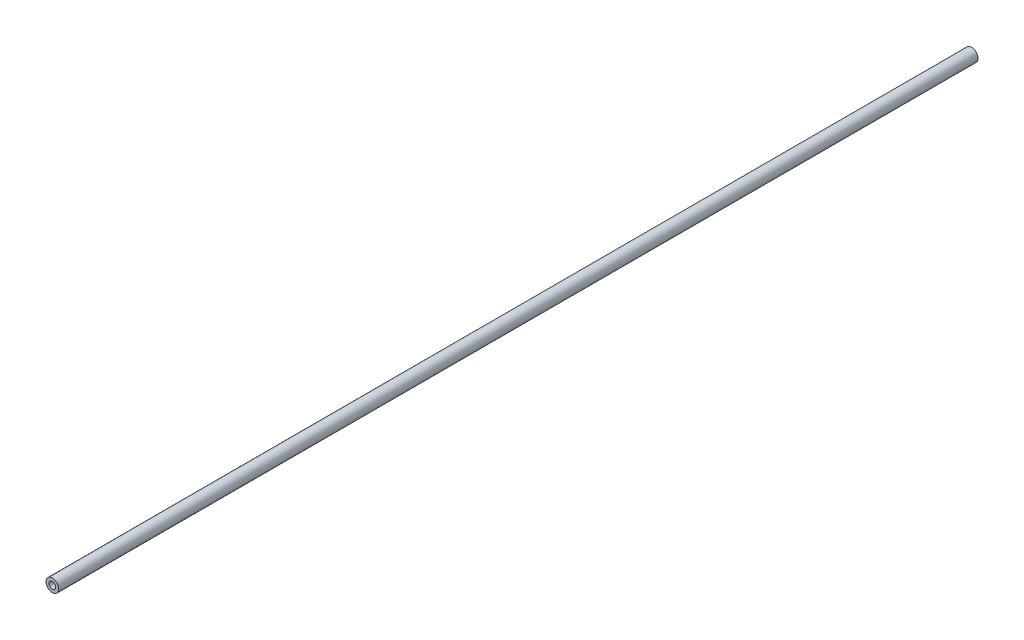
ISO-10303-21;
HEADER;
FILE_DESCRIPTION(('STEP AP214'),'2;1');
FILE_NAME('part.step','',(''),(''),'','','');
FILE_SCHEMA(('AUTOMOTIVE_DESIGN { 1 0 10303 214 1 1 1 1 }'));
ENDSEC;
DATA;
#1=APPLICATION_CONTEXT('core data for automotive mechanical design processes');
#2=APPLICATION_PROTOCOL_DEFINITION('international standard','automotive_design',2000,#1);
#3=PRODUCT_CONTEXT('',#1,'mechanical');
#4=PRODUCT('Part','Part','',(#3));
#5=PRODUCT_RELATED_PRODUCT_CATEGORY('part','',(#4));
#6=PRODUCT_DEFINITION_FORMATION('','',#4);
#7=PRODUCT_DEFINITION_CONTEXT('part definition',#1,'design');
#8=PRODUCT_DEFINITION('design','',#6,#7);
#9=PRODUCT_DEFINITION_SHAPE('','',#8);
#10=(LENGTH_UNIT() NAMED_UNIT(*) SI_UNIT(.MILLI.,.METRE.));
#11=(NAMED_UNIT(*) PLANE_ANGLE_UNIT() SI_UNIT($,.RADIAN.));
#12=(NAMED_UNIT(*) SI_UNIT($,.STERADIAN.) SOLID_ANGLE_UNIT());
#13=UNCERTAINTY_MEASURE_WITH_UNIT(LENGTH_MEASURE(1.E-05),#10,'distance_accuracy_value','');
#14=(GEOMETRIC_REPRESENTATION_CONTEXT(3) GLOBAL_UNCERTAINTY_ASSIGNED_CONTEXT((#13)) GLOBAL_UNIT_ASSIGNED_CONTEXT((#10,
#11,#12)) REPRESENTATION_CONTEXT('',''));
#15=CARTESIAN_POINT('',(0.,0.,0.));
#16=DIRECTION('',(0.,0.,1.));
#17=DIRECTION('',(1.,0.,0.));
#18=AXIS2_PLACEMENT_3D('',#15,#16,#17);
#19=CARTESIAN_POINT('',(0.,0.,-685.8));
#20=DIRECTION('',(0.,0.,1.));
#21=DIRECTION('',(1.,0.,0.));
#22=AXIS2_PLACEMENT_3D('',#19,#20,#21);
#23=CYLINDRICAL_SURFACE('',#22,4.7625);
#24=CARTESIAN_POINT('',(0.,0.,-685.8));
#25=DIRECTION('',(0.,0.,1.));
#26=DIRECTION('',(1.,0.,0.));
#27=AXIS2_PLACEMENT_3D('',#24,#25,#26);
#28=CIRCLE('',#27,4.7625);
#29=CARTESIAN_POINT('',(4.7625,0.,-685.8));
#30=VERTEX_POINT('',#29);
#31=EDGE_CURVE('E10',#30,#30,#28,.T.);
#32=ORIENTED_EDGE('',*,*,#31,.T.);
#33=EDGE_LOOP('',(#32));
#34=FACE_BOUND('',#33,.T.);
#35=CARTESIAN_POINT('',(0.,0.,0.));
#36=DIRECTION('',(0.,0.,1.));
#37=DIRECTION('',(1.,0.,0.));
#38=AXIS2_PLACEMENT_3D('',#35,#36,#37);
#39=CIRCLE('',#38,4.7625);
#40=CARTESIAN_POINT('',(4.7625,0.,0.));
#41=VERTEX_POINT('',#40);
#42=EDGE_CURVE('E40',#41,#41,#39,.T.);
#43=ORIENTED_EDGE('',*,*,#42,.F.);
#44=EDGE_LOOP('',(#43));
#45=FACE_BOUND('',#44,.T.);
#46=ADVANCED_FACE('F37',(#34,#45),#23,.T.);
#47=CARTESIAN_POINT('',(0.,0.,-685.8));
#48=DIRECTION('',(0.,0.,1.));
#49=DIRECTION('',(1.,0.,0.));
#50=AXIS2_PLACEMENT_3D('',#47,#48,#49);
#51=PLANE('',#50);
#52=CARTESIAN_POINT('',(0.,0.,-685.8));
#53=DIRECTION('',(0.,0.,1.));
#54=DIRECTION('',(1.,0.,0.));
#55=AXIS2_PLACEMENT_3D('',#52,#53,#54);
#56=CIRCLE('',#55,2.4892);
#57=CARTESIAN_POINT('',(2.4892,0.,-685.8));
#58=VERTEX_POINT('',#57);
#59=EDGE_CURVE('E47',#58,#58,#56,.T.);
#60=ORIENTED_EDGE('',*,*,#59,.T.);
#61=EDGE_LOOP('',(#60));
#62=FACE_BOUND('',#61,.T.);
#63=ORIENTED_EDGE('',*,*,#31,.F.);
#64=EDGE_LOOP('',(#63));
#65=FACE_BOUND('',#64,.T.);
#66=ADVANCED_FACE('F55',(#62,#65),#51,.F.);
#67=CARTESIAN_POINT('',(0.,0.,0.));
#68=DIRECTION('',(0.,0.,1.));
#69=DIRECTION('',(1.,0.,0.));
#70=AXIS2_PLACEMENT_3D('',#67,#68,#69);
#71=PLANE('',#70);
#72=CARTESIAN_POINT('',(0.,0.,0.));
#73=DIRECTION('',(0.,0.,1.));
#74=DIRECTION('',(1.,0.,0.));
#75=AXIS2_PLACEMENT_3D('',#72,#73,#74);
#76=CIRCLE('',#75,2.4892);
#77=CARTESIAN_POINT('',(2.4892,0.,0.));
#78=VERTEX_POINT('',#77);
#79=EDGE_CURVE('E49',#78,#78,#76,.T.);
#80=ORIENTED_EDGE('',*,*,#79,.F.);
#81=EDGE_LOOP('',(#80));
#82=FACE_BOUND('',#81,.T.);
#83=ORIENTED_EDGE('',*,*,#42,.T.);
#84=EDGE_LOOP('',(#83));
#85=FACE_BOUND('',#84,.T.);
#86=ADVANCED_FACE('F61',(#82,#85),#71,.T.);
#87=CARTESIAN_POINT('',(0.,0.,-685.8));
#88=DIRECTION('',(0.,0.,1.));
#89=DIRECTION('',(1.,0.,0.));
#90=AXIS2_PLACEMENT_3D('',#87,#88,#89);
#91=CYLINDRICAL_SURFACE('',#90,2.4892);
#92=ORIENTED_EDGE('',*,*,#59,.F.);
#93=EDGE_LOOP('',(#92));
#94=FACE_BOUND('',#93,.T.);
#95=ORIENTED_EDGE('',*,*,#79,.T.);
#96=EDGE_LOOP('',(#95));
#97=FACE_BOUND('',#96,.T.);
#98=ADVANCED_FACE('F58',(#94,#97),#91,.F.);
#99=CLOSED_SHELL('',(#46,#66,#86,#98));
#100=MANIFOLD_SOLID_BREP('B2',#99);
#101=ADVANCED_BREP_SHAPE_REPRESENTATION('',(#18,#100),#14);
#102=SHAPE_DEFINITION_REPRESENTATION(#9,#101);
ENDSEC;
END-ISO-10303-21;
